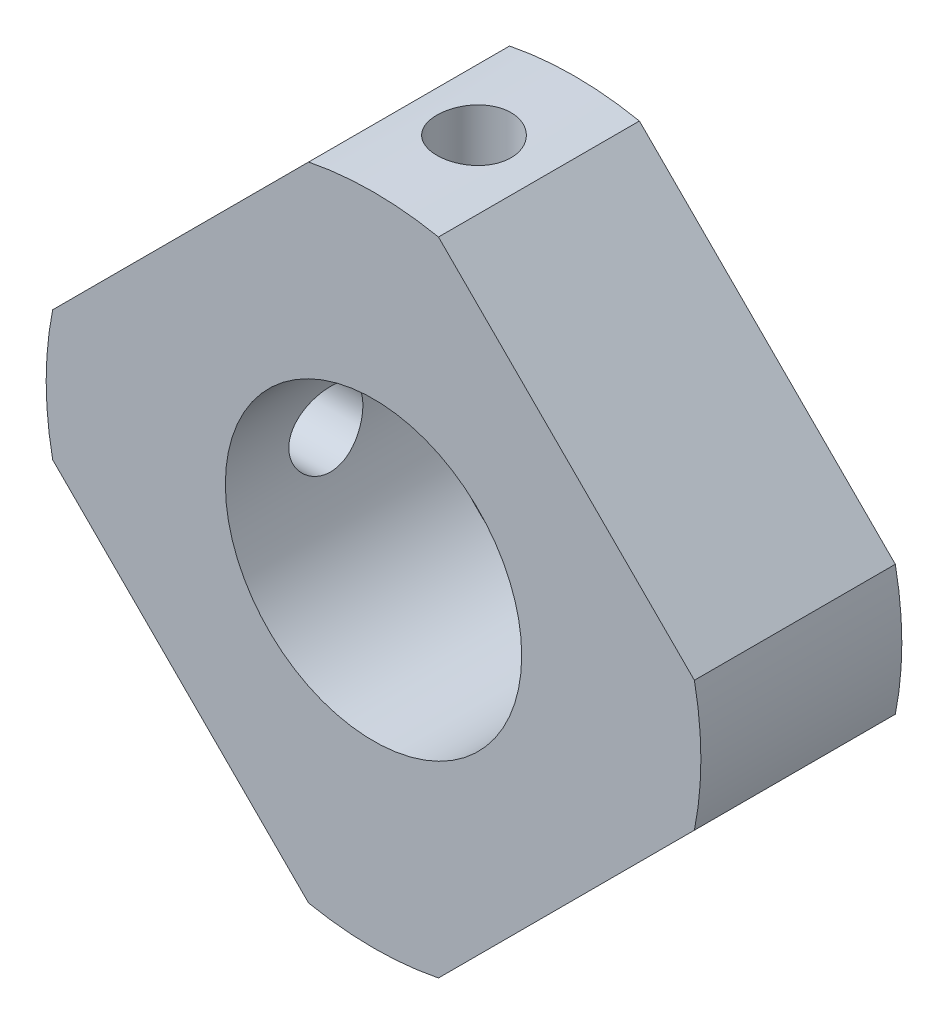
ISO-10303-21;
HEADER;
FILE_DESCRIPTION(('STEP AP214'),'2;1');
FILE_NAME('part.step','',(''),(''),'','','');
FILE_SCHEMA(('AUTOMOTIVE_DESIGN { 1 0 10303 214 1 1 1 1 }'));
ENDSEC;
DATA;
#1=APPLICATION_CONTEXT('core data for automotive mechanical design processes');
#2=APPLICATION_PROTOCOL_DEFINITION('international standard','automotive_design',2000,#1);
#3=PRODUCT_CONTEXT('',#1,'mechanical');
#4=PRODUCT('Part','Part','',(#3));
#5=PRODUCT_RELATED_PRODUCT_CATEGORY('part','',(#4));
#6=PRODUCT_DEFINITION_FORMATION('','',#4);
#7=PRODUCT_DEFINITION_CONTEXT('part definition',#1,'design');
#8=PRODUCT_DEFINITION('design','',#6,#7);
#9=PRODUCT_DEFINITION_SHAPE('','',#8);
#10=(LENGTH_UNIT() NAMED_UNIT(*) SI_UNIT(.MILLI.,.METRE.));
#11=(NAMED_UNIT(*) PLANE_ANGLE_UNIT() SI_UNIT($,.RADIAN.));
#12=(NAMED_UNIT(*) SI_UNIT($,.STERADIAN.) SOLID_ANGLE_UNIT());
#13=UNCERTAINTY_MEASURE_WITH_UNIT(LENGTH_MEASURE(1.E-05),#10,'distance_accuracy_value','');
#14=(GEOMETRIC_REPRESENTATION_CONTEXT(3) GLOBAL_UNCERTAINTY_ASSIGNED_CONTEXT((#13)) GLOBAL_UNIT_ASSIGNED_CONTEXT((#10,
#11,#12)) REPRESENTATION_CONTEXT('',''));
#15=CARTESIAN_POINT('',(0.,0.,0.));
#16=DIRECTION('',(0.,0.,1.));
#17=DIRECTION('',(1.,0.,0.));
#18=AXIS2_PLACEMENT_3D('',#15,#16,#17);
#19=CARTESIAN_POINT('',(0.,0.,-0.7775));
#20=DIRECTION('',(0.,0.,-1.));
#21=DIRECTION('',(-1.,0.,0.));
#22=AXIS2_PLACEMENT_3D('',#19,#20,#21);
#23=PLANE('',#22);
#24=CARTESIAN_POINT('',(0.,0.,-0.7775));
#25=DIRECTION('',(0.,0.,1.));
#26=DIRECTION('',(1.,0.,0.));
#27=AXIS2_PLACEMENT_3D('',#24,#25,#26);
#28=CIRCLE('',#27,7.2);
#29=CARTESIAN_POINT('',(7.2,0.,-0.7775));
#30=VERTEX_POINT('',#29);
#31=EDGE_CURVE('E20',#30,#30,#28,.T.);
#32=ORIENTED_EDGE('',*,*,#31,.F.);
#33=EDGE_LOOP('',(#32));
#34=FACE_BOUND('',#33,.T.);
#35=CARTESIAN_POINT('',(0.,0.,-0.777499999969677));
#36=DIRECTION('',(0.,0.,-1.));
#37=DIRECTION('',(0.,1.,0.));
#38=AXIS2_PLACEMENT_3D('',#35,#36,#37);
#39=CIRCLE('',#38,5.65999999997757);
#40=CARTESIAN_POINT('',(0.,5.65999999997757,-0.777499999969677));
#41=VERTEX_POINT('',#40);
#42=EDGE_CURVE('E277',#41,#41,#39,.F.);
#43=ORIENTED_EDGE('',*,*,#42,.T.);
#44=EDGE_LOOP('',(#43));
#45=FACE_BOUND('',#44,.T.);
#46=ADVANCED_FACE('F17',(#34,#45),#23,.T.);
#47=CARTESIAN_POINT('',(0.,0.,-0.7775));
#48=DIRECTION('',(0.,0.,1.));
#49=DIRECTION('',(1.,0.,0.));
#50=AXIS2_PLACEMENT_3D('',#47,#48,#49);
#51=CYLINDRICAL_SURFACE('',#50,7.2);
#52=ORIENTED_EDGE('',*,*,#31,.T.);
#53=EDGE_LOOP('',(#52));
#54=FACE_BOUND('',#53,.T.);
#55=CARTESIAN_POINT('',(0.,0.,0.));
#56=DIRECTION('',(0.,0.,1.));
#57=DIRECTION('',(1.,0.,0.));
#58=AXIS2_PLACEMENT_3D('',#55,#56,#57);
#59=CIRCLE('',#58,7.2);
#60=CARTESIAN_POINT('',(7.2,0.,0.));
#61=VERTEX_POINT('',#60);
#62=EDGE_CURVE('E200',#61,#61,#59,.F.);
#63=ORIENTED_EDGE('',*,*,#62,.T.);
#64=EDGE_LOOP('',(#63));
#65=FACE_BOUND('',#64,.T.);
#66=ADVANCED_FACE('F209',(#54,#65),#51,.T.);
#67=CARTESIAN_POINT('',(0.,0.,-0.777499999855991));
#68=DIRECTION('',(0.,0.,-1.));
#69=DIRECTION('',(0.,1.,0.));
#70=AXIS2_PLACEMENT_3D('',#67,#68,#69);
#71=CONICAL_SURFACE('',#70,5.65999999986389,0.785398163397448);
#72=ORIENTED_EDGE('',*,*,#42,.F.);
#73=EDGE_LOOP('',(#72));
#74=FACE_BOUND('',#73,.T.);
#75=CARTESIAN_POINT('',(0.,0.,-0.277499999999975));
#76=DIRECTION('',(0.,0.,1.));
#77=DIRECTION('',(1.,0.,0.));
#78=AXIS2_PLACEMENT_3D('',#75,#76,#77);
#79=CIRCLE('',#78,5.16);
#80=CARTESIAN_POINT('',(5.16,0.,-0.277499999999975));
#81=VERTEX_POINT('',#80);
#82=EDGE_CURVE('E90',#81,#81,#79,.T.);
#83=ORIENTED_EDGE('',*,*,#82,.T.);
#84=EDGE_LOOP('',(#83));
#85=FACE_BOUND('',#84,.T.);
#86=ADVANCED_FACE('F205',(#74,#85),#71,.F.);
#87=CARTESIAN_POINT('',(0.,11.401,3.49875));
#88=DIRECTION('',(0.,-1.,0.));
#89=DIRECTION('',(0.,0.,-1.));
#90=AXIS2_PLACEMENT_3D('',#87,#88,#89);
#91=CYLINDRICAL_SURFACE('',#90,1.29);
#92=CARTESIAN_POINT('',(0.,5.16,4.78875));
#93=CARTESIAN_POINT('',(-0.071190903754784,5.15999788647902,4.78874635904543));
#94=CARTESIAN_POINT('',(-0.142465526944808,5.15851032985863,4.78283070743921));
#95=CARTESIAN_POINT('',(-0.283035522912154,5.15271408475157,4.75933997997068));
#96=CARTESIAN_POINT('',(-0.352326912521383,5.14840008493651,4.74174295215403));
#97=CARTESIAN_POINT('',(-0.486785315274055,5.13742952101365,4.69548873234386));
#98=CARTESIAN_POINT('',(-0.551959176158829,5.13077697389399,4.66685049802864));
#99=CARTESIAN_POINT('',(-0.67655612083319,5.11583954874223,4.59938266477753));
#100=CARTESIAN_POINT('',(-0.735980685868809,5.1075550928333,4.56055570048286));
#101=CARTESIAN_POINT('',(-0.848647898938477,5.09005999564214,4.47295853273107));
#102=CARTESIAN_POINT('',(-0.901754923722288,5.08083498743362,4.42401673551234));
#103=CARTESIAN_POINT('',(-0.999101699239088,5.0625936293268,4.31794424120583));
#104=CARTESIAN_POINT('',(-1.04333996237656,5.05357731465753,4.26081217308046));
#105=CARTESIAN_POINT('',(-1.12232296929262,5.03663103715008,4.13893786380471));
#106=CARTESIAN_POINT('',(-1.15691717145442,5.02871917079593,4.07409531594256));
#107=CARTESIAN_POINT('',(-1.2146615250668,5.01508561085017,3.9392858222593));
#108=CARTESIAN_POINT('',(-1.23781359476811,5.00936355017834,3.86931973764865));
#109=CARTESIAN_POINT('',(-1.27155714852952,5.00090410235172,3.72773063446954));
#110=CARTESIAN_POINT('',(-1.28239093771019,4.99810922664553,3.6561688767461));
#111=CARTESIAN_POINT('',(-1.29194512797209,4.99564851748745,3.51219311870249));
#112=CARTESIAN_POINT('',(-1.29066748508311,4.99598217876809,3.43977925788601));
#113=CARTESIAN_POINT('',(-1.2762284359588,4.99968916119421,3.29801263617844));
#114=CARTESIAN_POINT('',(-1.26335586229603,5.00298859996107,3.22862822371923));
#115=CARTESIAN_POINT('',(-1.22655295427801,5.01213766451193,3.09303593429273));
#116=CARTESIAN_POINT('',(-1.20262175933407,5.01798748876647,3.02682830498736));
#117=CARTESIAN_POINT('',(-1.1441339833786,5.0316462099994,2.89869314841817));
#118=CARTESIAN_POINT('',(-1.10947227462679,5.03947434271427,2.83681574396513));
#119=CARTESIAN_POINT('',(-1.0305833560396,5.05619611053951,2.71965618622482));
#120=CARTESIAN_POINT('',(-0.986355112327044,5.06508986076723,2.66437474678121));
#121=CARTESIAN_POINT('',(-0.888100753494316,5.08325073614447,2.56032544028624));
#122=CARTESIAN_POINT('',(-0.833832461352556,5.09252129918065,2.51178660387163));
#123=CARTESIAN_POINT('',(-0.717789989904824,5.11016794257313,2.4244352081117));
#124=CARTESIAN_POINT('',(-0.656012598668595,5.11854363726126,2.38562683275027));
#125=CARTESIAN_POINT('',(-0.526361438583042,5.13349965673873,2.31875482119075));
#126=CARTESIAN_POINT('',(-0.458463211358607,5.14007231217693,2.29073688503316));
#127=CARTESIAN_POINT('',(-0.318802333196666,5.15061563257752,2.2466293096538));
#128=CARTESIAN_POINT('',(-0.247048068783434,5.15459171523917,2.23051482483153));
#129=CARTESIAN_POINT('',(-0.145585937262208,5.15802772236951,2.21665811202893));
#130=CARTESIAN_POINT('',(-0.11655707422069,5.15876550555189,2.21369543636887));
#131=CARTESIAN_POINT('',(-0.0583568311839987,5.1597520781768,2.20974063169468));
#132=CARTESIAN_POINT('',(-0.029185450851074,5.16000086645989,2.20874850735283));
#133=CARTESIAN_POINT('',(0.0711909037547823,5.15999788647902,2.20875364095455));
#134=CARTESIAN_POINT('',(0.142465526944806,5.15851032985863,2.21466929256079));
#135=CARTESIAN_POINT('',(0.283035522912152,5.15271408475156,2.23816002002932));
#136=CARTESIAN_POINT('',(0.352326912521382,5.14840008493651,2.25575704784598));
#137=CARTESIAN_POINT('',(0.486785315274055,5.13742952101365,2.30201126765614));
#138=CARTESIAN_POINT('',(0.551959176158829,5.13077697389399,2.33064950197136));
#139=CARTESIAN_POINT('',(0.676556120833191,5.11583954874223,2.39811733522248));
#140=CARTESIAN_POINT('',(0.735980685868809,5.1075550928333,2.43694429951714));
#141=CARTESIAN_POINT('',(0.848647898938477,5.09005999564214,2.52454146726893));
#142=CARTESIAN_POINT('',(0.901754923722288,5.08083498743362,2.57348326448766));
#143=CARTESIAN_POINT('',(0.999101699239088,5.0625936293268,2.67955575879417));
#144=CARTESIAN_POINT('',(1.04333996237656,5.05357731465753,2.73668782691954));
#145=CARTESIAN_POINT('',(1.12232296929262,5.03663103715008,2.85856213619529));
#146=CARTESIAN_POINT('',(1.15691717145442,5.02871917079593,2.92340468405744));
#147=CARTESIAN_POINT('',(1.21466152506681,5.01508561085017,3.0582141777407));
#148=CARTESIAN_POINT('',(1.23781359476811,5.00936355017834,3.12818026235135));
#149=CARTESIAN_POINT('',(1.27155714852952,5.00090410235172,3.26976936553046));
#150=CARTESIAN_POINT('',(1.28239093771019,4.99810922664553,3.3413311232539));
#151=CARTESIAN_POINT('',(1.29194512797209,4.99564851748745,3.48530688129751));
#152=CARTESIAN_POINT('',(1.29066748508311,4.99598217876809,3.55772074211399));
#153=CARTESIAN_POINT('',(1.2762284359588,4.99968916119421,3.69948736382156));
#154=CARTESIAN_POINT('',(1.26335586229603,5.00298859996107,3.76887177628077));
#155=CARTESIAN_POINT('',(1.22655295427801,5.01213766451193,3.90446406570727));
#156=CARTESIAN_POINT('',(1.20262175933407,5.01798748876647,3.97067169501264));
#157=CARTESIAN_POINT('',(1.1441339833786,5.0316462099994,4.09880685158183));
#158=CARTESIAN_POINT('',(1.10947227462679,5.03947434271427,4.16068425603487));
#159=CARTESIAN_POINT('',(1.0305833560396,5.05619611053951,4.27784381377518));
#160=CARTESIAN_POINT('',(0.986355112327043,5.06508986076723,4.33312525321879));
#161=CARTESIAN_POINT('',(0.888100753494315,5.08325073614447,4.43717455971376));
#162=CARTESIAN_POINT('',(0.833832461352556,5.09252129918065,4.48571339612837));
#163=CARTESIAN_POINT('',(0.717789989904825,5.11016794257313,4.5730647918883));
#164=CARTESIAN_POINT('',(0.656012598668595,5.11854363726126,4.61187316724973));
#165=CARTESIAN_POINT('',(0.526361438583041,5.13349965673873,4.67874517880925));
#166=CARTESIAN_POINT('',(0.458463211358606,5.14007231217693,4.70676311496684));
#167=CARTESIAN_POINT('',(0.318802333196666,5.15061563257752,4.7508706903462));
#168=CARTESIAN_POINT('',(0.247048068783434,5.15459171523917,4.76698517516847));
#169=CARTESIAN_POINT('',(0.145585937262208,5.15802772236952,4.78084188797107));
#170=CARTESIAN_POINT('',(0.11655707422069,5.15876550555189,4.78380456363113));
#171=CARTESIAN_POINT('',(0.058356831183998,5.1597520781768,4.78775936830532));
#172=CARTESIAN_POINT('',(0.029185450851073,5.16000086645989,4.78875149264717));
#173=CARTESIAN_POINT('',(0.,5.16,4.78875));
#174=B_SPLINE_CURVE_WITH_KNOTS('',3,(#92,#93,#94,#95,#96,#97,#98,#99,#100,#101,#102,#103,#104,
#105,#106,#107,#108,#109,#110,#111,#112,#113,#114,#115,#116,#117,#118,#119,#120,#121,#122,#123,
#124,#125,#126,#127,#128,#129,#130,#131,#132,#133,#134,#135,#136,#137,#138,#139,#140,#141,#142,
#143,#144,#145,#146,#147,#148,#149,#150,#151,#152,#153,#154,#155,#156,#157,#158,#159,#160,#161,
#162,#163,#164,#165,#166,#167,#168,#169,#170,#171,#172,#173),.UNSPECIFIED.,.T.,.F.,(4,2,2,2,2,2,
2,2,2,2,2,2,2,2,2,2,2,2,2,2,2,2,2,2,2,2,2,2,2,2,2,2,2,2,2,2,2,2,2,2,4),(0.,0.21346080406431,
0.427323889281876,0.640821396666923,0.85426375134839,1.07167819553489,1.28912907712496,
1.50980522723227,1.73044436886207,1.94666400945396,2.16284873057074,2.37379278233263,
2.58475325265536,2.79784967751461,3.01096914370602,3.23012921964416,3.44938337085077,
3.66955616248188,3.88926808750161,3.97677835504439,4.06428883007795,4.27774963414226,
4.49161271935983,4.70511022674487,4.91855258142634,5.13596702561284,5.35341790720291,
5.57409405731022,5.79473319894002,6.01095283953192,6.22713756064869,6.43808161241058,
6.64904208273331,6.86213850759257,7.07525797378397,7.29441804972211,7.51367220092872,
7.73384499255983,7.95355691757956,8.04106718512234,8.1285776601559),.UNSPECIFIED.);
#175=CARTESIAN_POINT('',(0.,5.16,4.78875));
#176=VERTEX_POINT('',#175);
#177=EDGE_CURVE('E194',#176,#176,#174,.T.);
#178=ORIENTED_EDGE('',*,*,#177,.T.);
#179=EDGE_LOOP('',(#178));
#180=FACE_BOUND('',#179,.T.);
#181=CARTESIAN_POINT('',(0.,11.4,4.78875));
#182=CARTESIAN_POINT('',(-0.0721472439682258,11.3999990905321,4.78874685665249));
#183=CARTESIAN_POINT('',(-0.144389555793133,11.399307323242,4.7826723158255));
#184=CARTESIAN_POINT('',(-0.286917089918186,11.396612808655,4.75852079382584));
#185=CARTESIAN_POINT('',(-0.357197900768133,11.3946073212056,4.74041872455081));
#186=CARTESIAN_POINT('',(-0.493644715145373,11.3895114207856,4.69274686330453));
#187=CARTESIAN_POINT('',(-0.559814864854268,11.3864221226132,4.66318885155587));
#188=CARTESIAN_POINT('',(-0.686223758085334,11.3795039017083,4.59346757277317));
#189=CARTESIAN_POINT('',(-0.74646501376437,11.3756752942861,4.55330882421236));
#190=CARTESIAN_POINT('',(-0.859620068045193,11.3676861724965,4.46332237388044));
#191=CARTESIAN_POINT('',(-0.912502399510318,11.3635243458604,4.41345521291808));
#192=CARTESIAN_POINT('',(-1.00916886522236,11.3553484157494,4.30554981187714));
#193=CARTESIAN_POINT('',(-1.05295210922367,11.3513343267607,4.24751077320123));
#194=CARTESIAN_POINT('',(-1.13028553883941,11.3438958640581,4.12471589378081));
#195=CARTESIAN_POINT('',(-1.16380758365309,11.3404731230722,4.05994222314994));
#196=CARTESIAN_POINT('',(-1.21948692851982,11.3346213039399,3.92564039904343));
#197=CARTESIAN_POINT('',(-1.24164468299635,11.3321921860624,3.85611243580354));
#198=CARTESIAN_POINT('',(-1.27387459715334,11.3286145677216,3.71459158443755));
#199=CARTESIAN_POINT('',(-1.28399822536437,11.3274606150312,3.64261055793433));
#200=CARTESIAN_POINT('',(-1.29203168679511,11.3265471960216,3.49796247124944));
#201=CARTESIAN_POINT('',(-1.28994190426707,11.3267876858311,3.42529543272256));
#202=CARTESIAN_POINT('',(-1.27365023457254,11.3286309897235,3.28169560578948));
#203=CARTESIAN_POINT('',(-1.25950490137394,11.3302274427091,3.21075630802219));
#204=CARTESIAN_POINT('',(-1.21959156135715,11.3345928904584,3.07226435113717));
#205=CARTESIAN_POINT('',(-1.19382325408011,11.3373619155336,3.00471177961791));
#206=CARTESIAN_POINT('',(-1.13133281662771,11.3437678894243,2.87473219515155));
#207=CARTESIAN_POINT('',(-1.09458548324298,11.3474068313183,2.81231740147325));
#208=CARTESIAN_POINT('',(-1.01120140945711,11.3551406374385,2.69452450140009));
#209=CARTESIAN_POINT('',(-0.964565106777244,11.3592354814811,2.63914608372341));
#210=CARTESIAN_POINT('',(-0.862421679642211,11.3674474990631,2.53667352705406));
#211=CARTESIAN_POINT('',(-0.806867459971433,11.3715646723115,2.48962632518416));
#212=CARTESIAN_POINT('',(-0.688594828944132,11.3793384424265,2.40549584432344));
#213=CARTESIAN_POINT('',(-0.625873136971337,11.3829948267628,2.36841715425137));
#214=CARTESIAN_POINT('',(-0.494995402905408,11.3894370530434,2.30528127718616));
#215=CARTESIAN_POINT('',(-0.426833636106462,11.3922219623435,2.27923588745453));
#216=CARTESIAN_POINT('',(-0.287158350661807,11.3965958116726,2.2390272330522));
#217=CARTESIAN_POINT('',(-0.215652276574025,11.3981872852079,2.22483879027908));
#218=CARTESIAN_POINT('',(-0.119719008003191,11.399396565858,2.21409240172387));
#219=CARTESIAN_POINT('',(-0.0958225061600318,11.3996223998837,2.21209049421805));
#220=CARTESIAN_POINT('',(-0.0479541710739476,11.3999242681335,2.20941877072804));
#221=CARTESIAN_POINT('',(-0.0239823378094466,11.4000003023146,2.20874895512541));
#222=CARTESIAN_POINT('',(0.072147243968225,11.3999990905321,2.20875314334751));
#223=CARTESIAN_POINT('',(0.144389555793132,11.399307323242,2.2148276841745));
#224=CARTESIAN_POINT('',(0.286917089918185,11.396612808655,2.23897920617416));
#225=CARTESIAN_POINT('',(0.357197900768132,11.3946073212056,2.25708127544919));
#226=CARTESIAN_POINT('',(0.493644715145373,11.3895114207856,2.30475313669547));
#227=CARTESIAN_POINT('',(0.559814864854268,11.3864221226132,2.33431114844413));
#228=CARTESIAN_POINT('',(0.686223758085334,11.3795039017083,2.40403242722683));
#229=CARTESIAN_POINT('',(0.746465013764369,11.3756752942861,2.44419117578764));
#230=CARTESIAN_POINT('',(0.859620068045192,11.3676861724965,2.53417762611956));
#231=CARTESIAN_POINT('',(0.912502399510317,11.3635243458604,2.58404478708192));
#232=CARTESIAN_POINT('',(1.00916886522236,11.3553484157494,2.69195018812286));
#233=CARTESIAN_POINT('',(1.05295210922367,11.3513343267607,2.74998922679877));
#234=CARTESIAN_POINT('',(1.13028553883941,11.3438958640581,2.87278410621919));
#235=CARTESIAN_POINT('',(1.16380758365309,11.3404731230722,2.93755777685006));
#236=CARTESIAN_POINT('',(1.21948692851982,11.3346213039399,3.07185960095658));
#237=CARTESIAN_POINT('',(1.24164468299635,11.3321921860624,3.14138756419646));
#238=CARTESIAN_POINT('',(1.27387459715334,11.3286145677216,3.28290841556245));
#239=CARTESIAN_POINT('',(1.28399822536437,11.3274606150312,3.35488944206567));
#240=CARTESIAN_POINT('',(1.29203168679511,11.3265471960216,3.49953752875056));
#241=CARTESIAN_POINT('',(1.28994190426707,11.3267876858311,3.57220456727744));
#242=CARTESIAN_POINT('',(1.27365023457254,11.3286309897235,3.71580439421052));
#243=CARTESIAN_POINT('',(1.25950490137394,11.3302274427091,3.78674369197781));
#244=CARTESIAN_POINT('',(1.21959156135715,11.3345928904584,3.92523564886283));
#245=CARTESIAN_POINT('',(1.19382325408011,11.3373619155336,3.99278822038209));
#246=CARTESIAN_POINT('',(1.13133281662771,11.3437678894243,4.12276780484845));
#247=CARTESIAN_POINT('',(1.09458548324298,11.3474068313183,4.18518259852675));
#248=CARTESIAN_POINT('',(1.01120140945711,11.3551406374385,4.30297549859991));
#249=CARTESIAN_POINT('',(0.964565106777245,11.3592354814811,4.35835391627659));
#250=CARTESIAN_POINT('',(0.862421679642212,11.3674474990631,4.46082647294594));
#251=CARTESIAN_POINT('',(0.806867459971434,11.3715646723115,4.50787367481584));
#252=CARTESIAN_POINT('',(0.688594828944132,11.3793384424265,4.59200415567656));
#253=CARTESIAN_POINT('',(0.625873136971338,11.3829948267628,4.62908284574863));
#254=CARTESIAN_POINT('',(0.494995402905409,11.3894370530434,4.69221872281384));
#255=CARTESIAN_POINT('',(0.426833636106463,11.3922219623435,4.71826411254547));
#256=CARTESIAN_POINT('',(0.287158350661808,11.3965958116726,4.7584727669478));
#257=CARTESIAN_POINT('',(0.215652276574025,11.3981872852079,4.77266120972092));
#258=CARTESIAN_POINT('',(0.11971900800319,11.399396565858,4.78340759827613));
#259=CARTESIAN_POINT('',(0.0958225061600311,11.3996223998837,4.78540950578195));
#260=CARTESIAN_POINT('',(0.0479541710739465,11.3999242681335,4.78808122927196));
#261=CARTESIAN_POINT('',(0.0239823378094457,11.4000003023146,4.78875104487459));
#262=CARTESIAN_POINT('',(0.,11.4,4.78875));
#263=B_SPLINE_CURVE_WITH_KNOTS('',3,(#181,#182,#183,#184,#185,#186,#187,#188,#189,#190,#191,
#192,#193,#194,#195,#196,#197,#198,#199,#200,#201,#202,#203,#204,#205,#206,#207,#208,#209,#210,
#211,#212,#213,#214,#215,#216,#217,#218,#219,#220,#221,#222,#223,#224,#225,#226,#227,#228,#229,
#230,#231,#232,#233,#234,#235,#236,#237,#238,#239,#240,#241,#242,#243,#244,#245,#246,#247,#248,
#249,#250,#251,#252,#253,#254,#255,#256,#257,#258,#259,#260,#261,#262),.UNSPECIFIED.,.T.,.F.,(4,
2,2,2,2,2,2,2,2,2,2,2,2,2,2,2,2,2,2,2,2,2,2,2,2,2,2,2,2,2,2,2,2,2,2,2,2,2,2,2,4),(0.,
0.21635036937941,0.433153444566424,0.64973416867851,0.866222725761203,1.08361028243464,
1.30101909808646,1.51901891183842,1.73701000775955,1.95406538819262,2.17111393977412,
2.38714986107761,2.60319136732208,2.81973267481046,3.03626439940306,3.25397970359516,
3.47179506021021,3.68984272974286,3.90742619222602,3.97934281539932,4.05125945917217,
4.26760982855158,4.48441290373859,4.70099362785068,4.91748218493337,5.13486974160681,
5.35227855725863,5.57027837101059,5.78826946693171,6.00532484736478,6.22237339894628,
6.43840932024978,6.65445082649424,6.87099213398263,7.08752385857522,7.30523916276733,
7.52305451938237,7.74110218891503,7.95868565139818,8.03060227457149,8.10251891834433),.UNSPECIFIED.);
#264=CARTESIAN_POINT('',(0.,11.4,4.78875));
#265=VERTEX_POINT('',#264);
#266=EDGE_CURVE('E145',#265,#265,#263,.T.);
#267=ORIENTED_EDGE('',*,*,#266,.F.);
#268=EDGE_LOOP('',(#267));
#269=FACE_BOUND('',#268,.T.);
#270=ADVANCED_FACE('F201',(#180,#269),#91,.F.);
#271=CARTESIAN_POINT('',(-11.401,0.,3.49875));
#272=DIRECTION('',(1.,0.,0.));
#273=DIRECTION('',(0.,0.,-1.));
#274=AXIS2_PLACEMENT_3D('',#271,#272,#273);
#275=CYLINDRICAL_SURFACE('',#274,1.29);
#276=CARTESIAN_POINT('',(-5.16,0.,4.78875));
#277=CARTESIAN_POINT('',(-5.15999788647902,-0.0711909037547834,4.78874635904543));
#278=CARTESIAN_POINT('',(-5.15851032985863,-0.142465526944807,4.78283070743921));
#279=CARTESIAN_POINT('',(-5.15271408475157,-0.283035522912153,4.75933997997068));
#280=CARTESIAN_POINT('',(-5.14840008493651,-0.352326912521382,4.74174295215403));
#281=CARTESIAN_POINT('',(-5.13742952101365,-0.486785315274054,4.69548873234386));
#282=CARTESIAN_POINT('',(-5.13077697389399,-0.551959176158827,4.66685049802864));
#283=CARTESIAN_POINT('',(-5.11583954874223,-0.676556120833189,4.59938266477753));
#284=CARTESIAN_POINT('',(-5.1075550928333,-0.735980685868807,4.56055570048287));
#285=CARTESIAN_POINT('',(-5.09005999564214,-0.848647898938476,4.47295853273107));
#286=CARTESIAN_POINT('',(-5.08083498743362,-0.901754923722287,4.42401673551234));
#287=CARTESIAN_POINT('',(-5.0625936293268,-0.999101699239087,4.31794424120584));
#288=CARTESIAN_POINT('',(-5.05357731465753,-1.04333996237656,4.26081217308047));
#289=CARTESIAN_POINT('',(-5.03663103715008,-1.12232296929262,4.13893786380471));
#290=CARTESIAN_POINT('',(-5.02871917079593,-1.15691717145442,4.07409531594256));
#291=CARTESIAN_POINT('',(-5.01508561085018,-1.2146615250668,3.9392858222593));
#292=CARTESIAN_POINT('',(-5.00936355017834,-1.23781359476811,3.86931973764865));
#293=CARTESIAN_POINT('',(-5.00090410235172,-1.27155714852952,3.72773063446954));
#294=CARTESIAN_POINT('',(-4.99810922664553,-1.28239093771019,3.6561688767461));
#295=CARTESIAN_POINT('',(-4.99564851748745,-1.29194512797209,3.51219311870249));
#296=CARTESIAN_POINT('',(-4.99598217876809,-1.29066748508311,3.43977925788601));
#297=CARTESIAN_POINT('',(-4.99968916119421,-1.2762284359588,3.29801263617844));
#298=CARTESIAN_POINT('',(-5.00298859996107,-1.26335586229603,3.22862822371923));
#299=CARTESIAN_POINT('',(-5.01213766451193,-1.22655295427801,3.09303593429274));
#300=CARTESIAN_POINT('',(-5.01798748876647,-1.20262175933407,3.02682830498736));
#301=CARTESIAN_POINT('',(-5.0316462099994,-1.1441339833786,2.89869314841817));
#302=CARTESIAN_POINT('',(-5.03947434271427,-1.10947227462679,2.83681574396513));
#303=CARTESIAN_POINT('',(-5.05619611053951,-1.03058335603961,2.71965618622482));
#304=CARTESIAN_POINT('',(-5.06508986076723,-0.986355112327045,2.66437474678121));
#305=CARTESIAN_POINT('',(-5.08325073614447,-0.888100753494317,2.56032544028624));
#306=CARTESIAN_POINT('',(-5.09252129918065,-0.833832461352557,2.51178660387163));
#307=CARTESIAN_POINT('',(-5.11016794257313,-0.717789989904826,2.4244352081117));
#308=CARTESIAN_POINT('',(-5.11854363726126,-0.656012598668596,2.38562683275027));
#309=CARTESIAN_POINT('',(-5.13349965673873,-0.526361438583043,2.31875482119075));
#310=CARTESIAN_POINT('',(-5.14007231217693,-0.458463211358608,2.29073688503316));
#311=CARTESIAN_POINT('',(-5.15061563257752,-0.318802333196668,2.2466293096538));
#312=CARTESIAN_POINT('',(-5.15459171523917,-0.247048068783436,2.23051482483153));
#313=CARTESIAN_POINT('',(-5.15802772236951,-0.14558593726221,2.21665811202893));
#314=CARTESIAN_POINT('',(-5.15876550555189,-0.116557074220692,2.21369543636887));
#315=CARTESIAN_POINT('',(-5.1597520781768,-0.0583568311839995,2.20974063169468));
#316=CARTESIAN_POINT('',(-5.16000086645989,-0.0291854508510744,2.20874850735283));
#317=CARTESIAN_POINT('',(-5.15999788647902,0.0711909037547825,2.20875364095455));
#318=CARTESIAN_POINT('',(-5.15851032985863,0.142465526944806,2.21466929256079));
#319=CARTESIAN_POINT('',(-5.15271408475156,0.283035522912153,2.23816002002932));
#320=CARTESIAN_POINT('',(-5.14840008493651,0.352326912521382,2.25575704784598));
#321=CARTESIAN_POINT('',(-5.13742952101365,0.486785315274055,2.30201126765614));
#322=CARTESIAN_POINT('',(-5.13077697389399,0.551959176158829,2.33064950197136));
#323=CARTESIAN_POINT('',(-5.11583954874223,0.67655612083319,2.39811733522248));
#324=CARTESIAN_POINT('',(-5.1075550928333,0.735980685868808,2.43694429951714));
#325=CARTESIAN_POINT('',(-5.09005999564214,0.848647898938476,2.52454146726893));
#326=CARTESIAN_POINT('',(-5.08083498743362,0.901754923722287,2.57348326448766));
#327=CARTESIAN_POINT('',(-5.0625936293268,0.999101699239087,2.67955575879417));
#328=CARTESIAN_POINT('',(-5.05357731465753,1.04333996237656,2.73668782691954));
#329=CARTESIAN_POINT('',(-5.03663103715008,1.12232296929262,2.85856213619529));
#330=CARTESIAN_POINT('',(-5.02871917079593,1.15691717145442,2.92340468405744));
#331=CARTESIAN_POINT('',(-5.01508561085018,1.2146615250668,3.05821417774071));
#332=CARTESIAN_POINT('',(-5.00936355017834,1.23781359476811,3.12818026235135));
#333=CARTESIAN_POINT('',(-5.00090410235172,1.27155714852952,3.26976936553046));
#334=CARTESIAN_POINT('',(-4.99810922664553,1.28239093771019,3.3413311232539));
#335=CARTESIAN_POINT('',(-4.99564851748745,1.29194512797209,3.48530688129751));
#336=CARTESIAN_POINT('',(-4.99598217876809,1.29066748508311,3.55772074211399));
#337=CARTESIAN_POINT('',(-4.99968916119421,1.2762284359588,3.69948736382156));
#338=CARTESIAN_POINT('',(-5.00298859996107,1.26335586229603,3.76887177628077));
#339=CARTESIAN_POINT('',(-5.01213766451193,1.22655295427801,3.90446406570727));
#340=CARTESIAN_POINT('',(-5.01798748876647,1.20262175933406,3.97067169501264));
#341=CARTESIAN_POINT('',(-5.0316462099994,1.1441339833786,4.09880685158183));
#342=CARTESIAN_POINT('',(-5.03947434271427,1.10947227462679,4.16068425603487));
#343=CARTESIAN_POINT('',(-5.05619611053951,1.0305833560396,4.27784381377518));
#344=CARTESIAN_POINT('',(-5.06508986076723,0.986355112327042,4.33312525321879));
#345=CARTESIAN_POINT('',(-5.08325073614447,0.888100753494315,4.43717455971376));
#346=CARTESIAN_POINT('',(-5.09252129918065,0.833832461352555,4.48571339612837));
#347=CARTESIAN_POINT('',(-5.11016794257313,0.717789989904824,4.5730647918883));
#348=CARTESIAN_POINT('',(-5.11854363726126,0.656012598668594,4.61187316724973));
#349=CARTESIAN_POINT('',(-5.13349965673873,0.52636143858304,4.67874517880925));
#350=CARTESIAN_POINT('',(-5.14007231217693,0.458463211358605,4.70676311496684));
#351=CARTESIAN_POINT('',(-5.15061563257752,0.318802333196664,4.7508706903462));
#352=CARTESIAN_POINT('',(-5.15459171523917,0.247048068783432,4.76698517516847));
#353=CARTESIAN_POINT('',(-5.15802772236952,0.145585937262207,4.78084188797107));
#354=CARTESIAN_POINT('',(-5.15876550555189,0.116557074220689,4.78380456363113));
#355=CARTESIAN_POINT('',(-5.1597520781768,0.0583568311839978,4.78775936830532));
#356=CARTESIAN_POINT('',(-5.16000086645989,0.0291854508510732,4.78875149264717));
#357=CARTESIAN_POINT('',(-5.16,0.,4.78875));
#358=B_SPLINE_CURVE_WITH_KNOTS('',3,(#276,#277,#278,#279,#280,#281,#282,#283,#284,#285,#286,
#287,#288,#289,#290,#291,#292,#293,#294,#295,#296,#297,#298,#299,#300,#301,#302,#303,#304,#305,
#306,#307,#308,#309,#310,#311,#312,#313,#314,#315,#316,#317,#318,#319,#320,#321,#322,#323,#324,
#325,#326,#327,#328,#329,#330,#331,#332,#333,#334,#335,#336,#337,#338,#339,#340,#341,#342,#343,
#344,#345,#346,#347,#348,#349,#350,#351,#352,#353,#354,#355,#356,#357),.UNSPECIFIED.,.T.,.F.,(4,
2,2,2,2,2,2,2,2,2,2,2,2,2,2,2,2,2,2,2,2,2,2,2,2,2,2,2,2,2,2,2,2,2,2,2,2,2,2,2,4),(0.,
0.21346080406431,0.427323889281876,0.640821396666922,0.85426375134839,1.07167819553489,
1.28912907712496,1.50980522723227,1.73044436886207,1.94666400945397,2.16284873057074,
2.37379278233263,2.58475325265536,2.79784967751462,3.01096914370602,3.23012921964416,
3.44938337085077,3.66955616248188,3.88926808750161,3.97677835504439,4.06428883007795,
4.27774963414226,4.49161271935983,4.70511022674488,4.91855258142634,5.13596702561285,
5.35341790720291,5.57409405731022,5.79473319894002,6.01095283953192,6.22713756064869,
6.43808161241058,6.64904208273331,6.86213850759257,7.07525797378397,7.29441804972212,
7.51367220092872,7.73384499255983,7.95355691757956,8.04106718512235,8.1285776601559),.UNSPECIFIED.);
#359=CARTESIAN_POINT('',(-5.16,0.,4.78875));
#360=VERTEX_POINT('',#359);
#361=EDGE_CURVE('E123',#360,#360,#358,.T.);
#362=ORIENTED_EDGE('',*,*,#361,.T.);
#363=EDGE_LOOP('',(#362));
#364=FACE_BOUND('',#363,.T.);
#365=CARTESIAN_POINT('',(-11.4,0.,4.78875));
#366=CARTESIAN_POINT('',(-11.3999990905321,-0.0721472439682268,4.78874685665249));
#367=CARTESIAN_POINT('',(-11.399307323242,-0.144389555793134,4.7826723158255));
#368=CARTESIAN_POINT('',(-11.396612808655,-0.286917089918187,4.75852079382584));
#369=CARTESIAN_POINT('',(-11.3946073212056,-0.357197900768134,4.74041872455081));
#370=CARTESIAN_POINT('',(-11.3895114207856,-0.493644715145374,4.69274686330453));
#371=CARTESIAN_POINT('',(-11.3864221226132,-0.559814864854269,4.66318885155587));
#372=CARTESIAN_POINT('',(-11.3795039017083,-0.686223758085335,4.59346757277317));
#373=CARTESIAN_POINT('',(-11.3756752942861,-0.74646501376437,4.55330882421236));
#374=CARTESIAN_POINT('',(-11.3676861724965,-0.859620068045193,4.46332237388044));
#375=CARTESIAN_POINT('',(-11.3635243458604,-0.912502399510319,4.41345521291808));
#376=CARTESIAN_POINT('',(-11.3553484157494,-1.00916886522237,4.30554981187714));
#377=CARTESIAN_POINT('',(-11.3513343267607,-1.05295210922367,4.24751077320123));
#378=CARTESIAN_POINT('',(-11.3438958640581,-1.13028553883941,4.12471589378081));
#379=CARTESIAN_POINT('',(-11.3404731230722,-1.16380758365309,4.05994222314994));
#380=CARTESIAN_POINT('',(-11.3346213039399,-1.21948692851982,3.92564039904343));
#381=CARTESIAN_POINT('',(-11.3321921860624,-1.24164468299635,3.85611243580354));
#382=CARTESIAN_POINT('',(-11.3286145677216,-1.27387459715334,3.71459158443755));
#383=CARTESIAN_POINT('',(-11.3274606150312,-1.28399822536437,3.64261055793433));
#384=CARTESIAN_POINT('',(-11.3265471960216,-1.29203168679511,3.49796247124944));
#385=CARTESIAN_POINT('',(-11.3267876858311,-1.28994190426707,3.42529543272256));
#386=CARTESIAN_POINT('',(-11.3286309897235,-1.27365023457254,3.28169560578948));
#387=CARTESIAN_POINT('',(-11.3302274427091,-1.25950490137394,3.21075630802219));
#388=CARTESIAN_POINT('',(-11.3345928904584,-1.21959156135715,3.07226435113717));
#389=CARTESIAN_POINT('',(-11.3373619155336,-1.19382325408011,3.00471177961791));
#390=CARTESIAN_POINT('',(-11.3437678894243,-1.13133281662771,2.87473219515155));
#391=CARTESIAN_POINT('',(-11.3474068313183,-1.09458548324298,2.81231740147325));
#392=CARTESIAN_POINT('',(-11.3551406374385,-1.01120140945711,2.69452450140009));
#393=CARTESIAN_POINT('',(-11.3592354814811,-0.964565106777244,2.63914608372341));
#394=CARTESIAN_POINT('',(-11.3674474990631,-0.862421679642212,2.53667352705406));
#395=CARTESIAN_POINT('',(-11.3715646723115,-0.806867459971434,2.48962632518416));
#396=CARTESIAN_POINT('',(-11.3793384424265,-0.688594828944133,2.40549584432344));
#397=CARTESIAN_POINT('',(-11.3829948267628,-0.625873136971338,2.36841715425137));
#398=CARTESIAN_POINT('',(-11.3894370530434,-0.494995402905409,2.30528127718616));
#399=CARTESIAN_POINT('',(-11.3922219623435,-0.426833636106462,2.27923588745453));
#400=CARTESIAN_POINT('',(-11.3965958116726,-0.287158350661807,2.2390272330522));
#401=CARTESIAN_POINT('',(-11.3981872852079,-0.215652276574025,2.22483879027908));
#402=CARTESIAN_POINT('',(-11.399396565858,-0.119719008003191,2.21409240172387));
#403=CARTESIAN_POINT('',(-11.3996223998837,-0.0958225061600324,2.21209049421805));
#404=CARTESIAN_POINT('',(-11.3999242681335,-0.0479541710739484,2.20941877072804));
#405=CARTESIAN_POINT('',(-11.4000003023146,-0.0239823378094473,2.20874895512541));
#406=CARTESIAN_POINT('',(-11.3999990905321,0.0721472439682244,2.20875314334751));
#407=CARTESIAN_POINT('',(-11.399307323242,0.144389555793132,2.2148276841745));
#408=CARTESIAN_POINT('',(-11.396612808655,0.286917089918185,2.23897920617416));
#409=CARTESIAN_POINT('',(-11.3946073212056,0.357197900768132,2.25708127544919));
#410=CARTESIAN_POINT('',(-11.3895114207856,0.493644715145372,2.30475313669547));
#411=CARTESIAN_POINT('',(-11.3864221226132,0.559814864854267,2.33431114844413));
#412=CARTESIAN_POINT('',(-11.3795039017083,0.686223758085333,2.40403242722683));
#413=CARTESIAN_POINT('',(-11.3756752942861,0.746465013764368,2.44419117578764));
#414=CARTESIAN_POINT('',(-11.3676861724965,0.859620068045191,2.53417762611956));
#415=CARTESIAN_POINT('',(-11.3635243458604,0.912502399510316,2.58404478708192));
#416=CARTESIAN_POINT('',(-11.3553484157494,1.00916886522236,2.69195018812286));
#417=CARTESIAN_POINT('',(-11.3513343267607,1.05295210922367,2.74998922679877));
#418=CARTESIAN_POINT('',(-11.3438958640581,1.13028553883941,2.87278410621919));
#419=CARTESIAN_POINT('',(-11.3404731230722,1.16380758365309,2.93755777685006));
#420=CARTESIAN_POINT('',(-11.3346213039399,1.21948692851982,3.07185960095657));
#421=CARTESIAN_POINT('',(-11.3321921860624,1.24164468299635,3.14138756419646));
#422=CARTESIAN_POINT('',(-11.3286145677216,1.27387459715334,3.28290841556245));
#423=CARTESIAN_POINT('',(-11.3274606150312,1.28399822536437,3.35488944206567));
#424=CARTESIAN_POINT('',(-11.3265471960216,1.29203168679511,3.49953752875056));
#425=CARTESIAN_POINT('',(-11.3267876858311,1.28994190426707,3.57220456727744));
#426=CARTESIAN_POINT('',(-11.3286309897235,1.27365023457254,3.71580439421052));
#427=CARTESIAN_POINT('',(-11.3302274427091,1.25950490137394,3.78674369197781));
#428=CARTESIAN_POINT('',(-11.3345928904584,1.21959156135715,3.92523564886283));
#429=CARTESIAN_POINT('',(-11.3373619155336,1.19382325408011,3.99278822038209));
#430=CARTESIAN_POINT('',(-11.3437678894243,1.13133281662771,4.12276780484845));
#431=CARTESIAN_POINT('',(-11.3474068313183,1.09458548324298,4.18518259852675));
#432=CARTESIAN_POINT('',(-11.3551406374385,1.01120140945711,4.30297549859991));
#433=CARTESIAN_POINT('',(-11.3592354814811,0.964565106777245,4.35835391627659));
#434=CARTESIAN_POINT('',(-11.3674474990631,0.862421679642212,4.46082647294594));
#435=CARTESIAN_POINT('',(-11.3715646723115,0.806867459971434,4.50787367481584));
#436=CARTESIAN_POINT('',(-11.3793384424265,0.688594828944132,4.59200415567656));
#437=CARTESIAN_POINT('',(-11.3829948267628,0.625873136971337,4.62908284574863));
#438=CARTESIAN_POINT('',(-11.3894370530434,0.494995402905408,4.69221872281384));
#439=CARTESIAN_POINT('',(-11.3922219623435,0.426833636106462,4.71826411254547));
#440=CARTESIAN_POINT('',(-11.3965958116726,0.287158350661807,4.7584727669478));
#441=CARTESIAN_POINT('',(-11.3981872852079,0.215652276574025,4.77266120972092));
#442=CARTESIAN_POINT('',(-11.399396565858,0.11971900800319,4.78340759827613));
#443=CARTESIAN_POINT('',(-11.3996223998837,0.0958225061600311,4.78540950578195));
#444=CARTESIAN_POINT('',(-11.3999242681335,0.0479541710739464,4.78808122927196));
#445=CARTESIAN_POINT('',(-11.4000003023146,0.0239823378094452,4.78875104487459));
#446=CARTESIAN_POINT('',(-11.4,0.,4.78875));
#447=B_SPLINE_CURVE_WITH_KNOTS('',3,(#365,#366,#367,#368,#369,#370,#371,#372,#373,#374,#375,
#376,#377,#378,#379,#380,#381,#382,#383,#384,#385,#386,#387,#388,#389,#390,#391,#392,#393,#394,
#395,#396,#397,#398,#399,#400,#401,#402,#403,#404,#405,#406,#407,#408,#409,#410,#411,#412,#413,
#414,#415,#416,#417,#418,#419,#420,#421,#422,#423,#424,#425,#426,#427,#428,#429,#430,#431,#432,
#433,#434,#435,#436,#437,#438,#439,#440,#441,#442,#443,#444,#445,#446),.UNSPECIFIED.,.T.,.F.,(4,
2,2,2,2,2,2,2,2,2,2,2,2,2,2,2,2,2,2,2,2,2,2,2,2,2,2,2,2,2,2,2,2,2,2,2,2,2,2,2,4),(0.,
0.21635036937941,0.433153444566424,0.64973416867851,0.866222725761203,1.08361028243464,
1.30101909808646,1.51901891183842,1.73701000775955,1.95406538819262,2.17111393977412,
2.38714986107761,2.60319136732208,2.81973267481046,3.03626439940305,3.25397970359516,
3.47179506021021,3.68984272974286,3.90742619222601,3.97934281539932,4.05125945917216,
4.26760982855157,4.48441290373859,4.70099362785067,4.91748218493337,5.13486974160681,
5.35227855725863,5.57027837101059,5.78826946693171,6.00532484736478,6.22237339894628,
6.43840932024978,6.65445082649424,6.87099213398262,7.08752385857522,7.30523916276732,
7.52305451938237,7.74110218891503,7.95868565139818,8.03060227457148,8.10251891834433),.UNSPECIFIED.);
#448=CARTESIAN_POINT('',(-11.4,0.,4.78875));
#449=VERTEX_POINT('',#448);
#450=EDGE_CURVE('E137',#449,#449,#447,.T.);
#451=ORIENTED_EDGE('',*,*,#450,.F.);
#452=EDGE_LOOP('',(#451));
#453=FACE_BOUND('',#452,.T.);
#454=ADVANCED_FACE('F152',(#364,#453),#275,.F.);
#455=CARTESIAN_POINT('',(0.,0.,0.));
#456=DIRECTION('',(0.,0.,1.));
#457=DIRECTION('',(1.,0.,0.));
#458=AXIS2_PLACEMENT_3D('',#455,#456,#457);
#459=PLANE('',#458);
#460=ORIENTED_EDGE('',*,*,#62,.F.);
#461=EDGE_LOOP('',(#460));
#462=FACE_BOUND('',#461,.T.);
#463=DIRECTION('',(-0.707106781186547,0.707106781186548,0.));
#464=VECTOR('',#463,1.);
#465=CARTESIAN_POINT('',(-11.1734093931045,-2.26161944943994,0.));
#466=LINE('',#465,#464);
#467=CARTESIAN_POINT('',(-2.26161944943995,-11.1734093931045,0.));
#468=VERTEX_POINT('',#467);
#469=CARTESIAN_POINT('',(-11.1734093931045,-2.26161944943994,0.));
#470=VERTEX_POINT('',#469);
#471=EDGE_CURVE('E83',#468,#470,#466,.T.);
#472=ORIENTED_EDGE('',*,*,#471,.T.);
#473=CARTESIAN_POINT('',(0.,0.,0.));
#474=DIRECTION('',(0.,0.,-1.));
#475=DIRECTION('',(-1.,0.,0.));
#476=AXIS2_PLACEMENT_3D('',#473,#474,#475);
#477=CIRCLE('',#476,11.4);
#478=CARTESIAN_POINT('',(-11.1734093931045,2.26161944943994,0.));
#479=VERTEX_POINT('',#478);
#480=EDGE_CURVE('E135',#479,#470,#477,.F.);
#481=ORIENTED_EDGE('',*,*,#480,.F.);
#482=DIRECTION('',(0.707106781186548,0.707106781186548,0.));
#483=VECTOR('',#482,1.);
#484=CARTESIAN_POINT('',(-2.26161944943994,11.1734093931045,0.));
#485=LINE('',#484,#483);
#486=CARTESIAN_POINT('',(-2.26161944943994,11.1734093931045,0.));
#487=VERTEX_POINT('',#486);
#488=EDGE_CURVE('E109',#479,#487,#485,.T.);
#489=ORIENTED_EDGE('',*,*,#488,.T.);
#490=CARTESIAN_POINT('',(0.,0.,0.));
#491=DIRECTION('',(0.,0.,-1.));
#492=DIRECTION('',(-1.,0.,0.));
#493=AXIS2_PLACEMENT_3D('',#490,#491,#492);
#494=CIRCLE('',#493,11.4);
#495=CARTESIAN_POINT('',(2.26161944943994,11.1734093931045,0.));
#496=VERTEX_POINT('',#495);
#497=EDGE_CURVE('E117',#496,#487,#494,.F.);
#498=ORIENTED_EDGE('',*,*,#497,.F.);
#499=DIRECTION('',(0.707106781186547,-0.707106781186548,0.));
#500=VECTOR('',#499,1.);
#501=CARTESIAN_POINT('',(11.1734093931045,2.26161944943994,0.));
#502=LINE('',#501,#500);
#503=CARTESIAN_POINT('',(11.1734093931045,2.26161944943994,0.));
#504=VERTEX_POINT('',#503);
#505=EDGE_CURVE('E114',#496,#504,#502,.T.);
#506=ORIENTED_EDGE('',*,*,#505,.T.);
#507=CARTESIAN_POINT('',(0.,0.,0.));
#508=DIRECTION('',(0.,0.,-1.));
#509=DIRECTION('',(-1.,0.,0.));
#510=AXIS2_PLACEMENT_3D('',#507,#508,#509);
#511=CIRCLE('',#510,11.4);
#512=CARTESIAN_POINT('',(11.1734093931045,-2.26161944943993,0.));
#513=VERTEX_POINT('',#512);
#514=EDGE_CURVE('E120',#513,#504,#511,.F.);
#515=ORIENTED_EDGE('',*,*,#514,.F.);
#516=DIRECTION('',(-0.707106781186547,-0.707106781186548,0.));
#517=VECTOR('',#516,1.);
#518=CARTESIAN_POINT('',(2.26161944943994,-11.1734093931045,0.));
#519=LINE('',#518,#517);
#520=CARTESIAN_POINT('',(2.26161944943994,-11.1734093931045,0.));
#521=VERTEX_POINT('',#520);
#522=EDGE_CURVE('E86',#513,#521,#519,.T.);
#523=ORIENTED_EDGE('',*,*,#522,.T.);
#524=CARTESIAN_POINT('',(0.,0.,0.));
#525=DIRECTION('',(0.,0.,-1.));
#526=DIRECTION('',(-1.,0.,0.));
#527=AXIS2_PLACEMENT_3D('',#524,#525,#526);
#528=CIRCLE('',#527,11.4);
#529=EDGE_CURVE('E79',#468,#521,#528,.F.);
#530=ORIENTED_EDGE('',*,*,#529,.F.);
#531=EDGE_LOOP('',(#472,#481,#489,#498,#506,#515,#523,#530));
#532=FACE_BOUND('',#531,.T.);
#533=ADVANCED_FACE('F81',(#462,#532),#459,.F.);
#534=CARTESIAN_POINT('',(0.,0.,-0.00100000000000013));
#535=DIRECTION('',(0.,0.,1.));
#536=DIRECTION('',(1.,0.,0.));
#537=AXIS2_PLACEMENT_3D('',#534,#535,#536);
#538=CYLINDRICAL_SURFACE('',#537,5.16);
#539=CARTESIAN_POINT('',(0.,0.,6.9975));
#540=DIRECTION('',(0.,0.,1.));
#541=DIRECTION('',(1.,0.,0.));
#542=AXIS2_PLACEMENT_3D('',#539,#540,#541);
#543=CIRCLE('',#542,5.16);
#544=CARTESIAN_POINT('',(5.16,0.,6.9975));
#545=VERTEX_POINT('',#544);
#546=EDGE_CURVE('E102',#545,#545,#543,.F.);
#547=ORIENTED_EDGE('',*,*,#546,.F.);
#548=EDGE_LOOP('',(#547));
#549=FACE_BOUND('',#548,.T.);
#550=ORIENTED_EDGE('',*,*,#361,.F.);
#551=EDGE_LOOP('',(#550));
#552=FACE_BOUND('',#551,.T.);
#553=ORIENTED_EDGE('',*,*,#82,.F.);
#554=EDGE_LOOP('',(#553));
#555=FACE_BOUND('',#554,.T.);
#556=ORIENTED_EDGE('',*,*,#177,.F.);
#557=EDGE_LOOP('',(#556));
#558=FACE_BOUND('',#557,.T.);
#559=ADVANCED_FACE('F184',(#549,#552,#555,#558),#538,.F.);
#560=CARTESIAN_POINT('',(0.,0.,6.9975));
#561=DIRECTION('',(0.,0.,-1.));
#562=DIRECTION('',(-1.,0.,0.));
#563=AXIS2_PLACEMENT_3D('',#560,#561,#562);
#564=CYLINDRICAL_SURFACE('',#563,11.4);
#565=CARTESIAN_POINT('',(0.,0.,6.9975));
#566=DIRECTION('',(0.,0.,-1.));
#567=DIRECTION('',(-1.,0.,0.));
#568=AXIS2_PLACEMENT_3D('',#565,#566,#567);
#569=CIRCLE('',#568,11.4);
#570=CARTESIAN_POINT('',(-2.26161944943995,-11.1734093931045,6.9975));
#571=VERTEX_POINT('',#570);
#572=CARTESIAN_POINT('',(2.26161944943994,-11.1734093931045,6.9975));
#573=VERTEX_POINT('',#572);
#574=EDGE_CURVE('E96',#571,#573,#569,.F.);
#575=ORIENTED_EDGE('',*,*,#574,.F.);
#576=DIRECTION('',(0.,0.,1.));
#577=VECTOR('',#576,1.);
#578=CARTESIAN_POINT('',(-2.26161944943995,-11.1734093931045,6.9975));
#579=LINE('',#578,#577);
#580=EDGE_CURVE('E93',#571,#468,#579,.F.);
#581=ORIENTED_EDGE('',*,*,#580,.T.);
#582=ORIENTED_EDGE('',*,*,#529,.T.);
#583=DIRECTION('',(0.,0.,1.));
#584=VECTOR('',#583,1.);
#585=CARTESIAN_POINT('',(2.26161944943994,-11.1734093931045,6.9975));
#586=LINE('',#585,#584);
#587=EDGE_CURVE('E89',#521,#573,#586,.T.);
#588=ORIENTED_EDGE('',*,*,#587,.T.);
#589=EDGE_LOOP('',(#575,#581,#582,#588));
#590=FACE_BOUND('',#589,.T.);
#591=ADVANCED_FACE('F94',(#590),#564,.T.);
#592=CARTESIAN_POINT('',(2.26161944943994,-11.1734093931045,6.9975));
#593=DIRECTION('',(-0.707106781186548,0.707106781186547,0.));
#594=DIRECTION('',(-0.707106781186547,-0.707106781186548,0.));
#595=AXIS2_PLACEMENT_3D('',#592,#593,#594);
#596=PLANE('',#595);
#597=DIRECTION('',(0.,0.,-1.));
#598=VECTOR('',#597,1.);
#599=CARTESIAN_POINT('',(11.1734093931045,-2.26161944943993,6.9975));
#600=LINE('',#599,#598);
#601=CARTESIAN_POINT('',(11.1734093931045,-2.26161944943993,6.9975));
#602=VERTEX_POINT('',#601);
#603=EDGE_CURVE('E245',#602,#513,#600,.T.);
#604=ORIENTED_EDGE('',*,*,#603,.F.);
#605=DIRECTION('',(0.707106781186547,0.707106781186548,0.));
#606=VECTOR('',#605,1.);
#607=CARTESIAN_POINT('',(2.26161944943994,-11.1734093931045,6.9975));
#608=LINE('',#607,#606);
#609=EDGE_CURVE('E133',#573,#602,#608,.T.);
#610=ORIENTED_EDGE('',*,*,#609,.F.);
#611=ORIENTED_EDGE('',*,*,#587,.F.);
#612=ORIENTED_EDGE('',*,*,#522,.F.);
#613=EDGE_LOOP('',(#604,#610,#611,#612));
#614=FACE_BOUND('',#613,.T.);
#615=ADVANCED_FACE('F177',(#614),#596,.F.);
#616=CARTESIAN_POINT('',(0.,0.,6.9975));
#617=DIRECTION('',(0.,0.,-1.));
#618=DIRECTION('',(-1.,0.,0.));
#619=AXIS2_PLACEMENT_3D('',#616,#617,#618);
#620=CYLINDRICAL_SURFACE('',#619,11.4);
#621=CARTESIAN_POINT('',(0.,0.,6.9975));
#622=DIRECTION('',(0.,0.,-1.));
#623=DIRECTION('',(-1.,0.,0.));
#624=AXIS2_PLACEMENT_3D('',#621,#622,#623);
#625=CIRCLE('',#624,11.4);
#626=CARTESIAN_POINT('',(11.1734093931045,2.26161944943993,6.9975));
#627=VERTEX_POINT('',#626);
#628=EDGE_CURVE('E130',#602,#627,#625,.F.);
#629=ORIENTED_EDGE('',*,*,#628,.F.);
#630=ORIENTED_EDGE('',*,*,#603,.T.);
#631=ORIENTED_EDGE('',*,*,#514,.T.);
#632=DIRECTION('',(0.,0.,1.));
#633=VECTOR('',#632,1.);
#634=CARTESIAN_POINT('',(11.1734093931045,2.26161944943993,6.9975));
#635=LINE('',#634,#633);
#636=EDGE_CURVE('E118',#504,#627,#635,.T.);
#637=ORIENTED_EDGE('',*,*,#636,.T.);
#638=EDGE_LOOP('',(#629,#630,#631,#637));
#639=FACE_BOUND('',#638,.T.);
#640=ADVANCED_FACE('F173',(#639),#620,.T.);
#641=CARTESIAN_POINT('',(11.1734093931045,2.26161944943994,6.9975));
#642=DIRECTION('',(-0.707106781186548,-0.707106781186547,0.));
#643=DIRECTION('',(0.707106781186547,-0.707106781186548,0.));
#644=AXIS2_PLACEMENT_3D('',#641,#642,#643);
#645=PLANE('',#644);
#646=DIRECTION('',(0.,0.,-1.));
#647=VECTOR('',#646,1.);
#648=CARTESIAN_POINT('',(2.26161944943994,11.1734093931045,6.9975));
#649=LINE('',#648,#647);
#650=CARTESIAN_POINT('',(2.26161944943994,11.1734093931045,6.9975));
#651=VERTEX_POINT('',#650);
#652=EDGE_CURVE('E237',#651,#496,#649,.T.);
#653=ORIENTED_EDGE('',*,*,#652,.F.);
#654=DIRECTION('',(-0.707106781186547,0.707106781186548,0.));
#655=VECTOR('',#654,1.);
#656=CARTESIAN_POINT('',(11.1734093931045,2.26161944943993,6.9975));
#657=LINE('',#656,#655);
#658=EDGE_CURVE('E129',#627,#651,#657,.T.);
#659=ORIENTED_EDGE('',*,*,#658,.F.);
#660=ORIENTED_EDGE('',*,*,#636,.F.);
#661=ORIENTED_EDGE('',*,*,#505,.F.);
#662=EDGE_LOOP('',(#653,#659,#660,#661));
#663=FACE_BOUND('',#662,.T.);
#664=ADVANCED_FACE('F169',(#663),#645,.F.);
#665=CARTESIAN_POINT('',(0.,0.,6.9975));
#666=DIRECTION('',(0.,0.,-1.));
#667=DIRECTION('',(-1.,0.,0.));
#668=AXIS2_PLACEMENT_3D('',#665,#666,#667);
#669=CYLINDRICAL_SURFACE('',#668,11.4);
#670=ORIENTED_EDGE('',*,*,#266,.T.);
#671=EDGE_LOOP('',(#670));
#672=FACE_BOUND('',#671,.T.);
#673=CARTESIAN_POINT('',(0.,0.,6.9975));
#674=DIRECTION('',(0.,0.,-1.));
#675=DIRECTION('',(-1.,0.,0.));
#676=AXIS2_PLACEMENT_3D('',#673,#674,#675);
#677=CIRCLE('',#676,11.4);
#678=CARTESIAN_POINT('',(-2.26161944943994,11.1734093931045,6.9975));
#679=VERTEX_POINT('',#678);
#680=EDGE_CURVE('E126',#651,#679,#677,.F.);
#681=ORIENTED_EDGE('',*,*,#680,.F.);
#682=ORIENTED_EDGE('',*,*,#652,.T.);
#683=ORIENTED_EDGE('',*,*,#497,.T.);
#684=DIRECTION('',(0.,0.,1.));
#685=VECTOR('',#684,1.);
#686=CARTESIAN_POINT('',(-2.26161944943994,11.1734093931045,6.9975));
#687=LINE('',#686,#685);
#688=EDGE_CURVE('E113',#487,#679,#687,.T.);
#689=ORIENTED_EDGE('',*,*,#688,.T.);
#690=EDGE_LOOP('',(#681,#682,#683,#689));
#691=FACE_BOUND('',#690,.T.);
#692=ADVANCED_FACE('F164',(#672,#691),#669,.T.);
#693=CARTESIAN_POINT('',(-2.26161944943994,11.1734093931045,6.9975));
#694=DIRECTION('',(0.707106781186548,-0.707106781186548,0.));
#695=DIRECTION('',(0.707106781186548,0.707106781186548,0.));
#696=AXIS2_PLACEMENT_3D('',#693,#694,#695);
#697=PLANE('',#696);
#698=DIRECTION('',(0.,0.,-1.));
#699=VECTOR('',#698,1.);
#700=CARTESIAN_POINT('',(-11.1734093931045,2.26161944943994,6.9975));
#701=LINE('',#700,#699);
#702=CARTESIAN_POINT('',(-11.1734093931045,2.26161944943994,6.9975));
#703=VERTEX_POINT('',#702);
#704=EDGE_CURVE('E112',#703,#479,#701,.T.);
#705=ORIENTED_EDGE('',*,*,#704,.F.);
#706=DIRECTION('',(-0.707106781186547,-0.707106781186547,0.));
#707=VECTOR('',#706,1.);
#708=CARTESIAN_POINT('',(-2.26161944943994,11.1734093931045,6.9975));
#709=LINE('',#708,#707);
#710=EDGE_CURVE('E125',#679,#703,#709,.T.);
#711=ORIENTED_EDGE('',*,*,#710,.F.);
#712=ORIENTED_EDGE('',*,*,#688,.F.);
#713=ORIENTED_EDGE('',*,*,#488,.F.);
#714=EDGE_LOOP('',(#705,#711,#712,#713));
#715=FACE_BOUND('',#714,.T.);
#716=ADVANCED_FACE('F160',(#715),#697,.F.);
#717=CARTESIAN_POINT('',(0.,0.,6.9975));
#718=DIRECTION('',(0.,0.,-1.));
#719=DIRECTION('',(-1.,0.,0.));
#720=AXIS2_PLACEMENT_3D('',#717,#718,#719);
#721=CYLINDRICAL_SURFACE('',#720,11.4);
#722=ORIENTED_EDGE('',*,*,#450,.T.);
#723=EDGE_LOOP('',(#722));
#724=FACE_BOUND('',#723,.T.);
#725=ORIENTED_EDGE('',*,*,#480,.T.);
#726=DIRECTION('',(0.,0.,1.));
#727=VECTOR('',#726,1.);
#728=CARTESIAN_POINT('',(-11.1734093931045,-2.26161944943994,6.9975));
#729=LINE('',#728,#727);
#730=CARTESIAN_POINT('',(-11.1734093931045,-2.26161944943994,6.9975));
#731=VERTEX_POINT('',#730);
#732=EDGE_CURVE('E99',#470,#731,#729,.T.);
#733=ORIENTED_EDGE('',*,*,#732,.T.);
#734=CARTESIAN_POINT('',(0.,0.,6.9975));
#735=DIRECTION('',(0.,0.,-1.));
#736=DIRECTION('',(-1.,0.,0.));
#737=AXIS2_PLACEMENT_3D('',#734,#735,#736);
#738=CIRCLE('',#737,11.4);
#739=EDGE_CURVE('E26',#703,#731,#738,.F.);
#740=ORIENTED_EDGE('',*,*,#739,.F.);
#741=ORIENTED_EDGE('',*,*,#704,.T.);
#742=EDGE_LOOP('',(#725,#733,#740,#741));
#743=FACE_BOUND('',#742,.T.);
#744=ADVANCED_FACE('F155',(#724,#743),#721,.T.);
#745=CARTESIAN_POINT('',(-11.1734093931045,-2.26161944943994,6.9975));
#746=DIRECTION('',(0.707106781186548,0.707106781186547,0.));
#747=DIRECTION('',(-0.707106781186547,0.707106781186548,0.));
#748=AXIS2_PLACEMENT_3D('',#745,#746,#747);
#749=PLANE('',#748);
#750=ORIENTED_EDGE('',*,*,#580,.F.);
#751=DIRECTION('',(0.707106781186547,-0.707106781186548,0.));
#752=VECTOR('',#751,1.);
#753=CARTESIAN_POINT('',(-11.1734093931045,-2.26161944943994,6.9975));
#754=LINE('',#753,#752);
#755=EDGE_CURVE('E11',#731,#571,#754,.T.);
#756=ORIENTED_EDGE('',*,*,#755,.F.);
#757=ORIENTED_EDGE('',*,*,#732,.F.);
#758=ORIENTED_EDGE('',*,*,#471,.F.);
#759=EDGE_LOOP('',(#750,#756,#757,#758));
#760=FACE_BOUND('',#759,.T.);
#761=ADVANCED_FACE('F101',(#760),#749,.F.);
#762=CARTESIAN_POINT('',(0.,0.,6.9975));
#763=DIRECTION('',(0.,0.,1.));
#764=DIRECTION('',(1.,0.,0.));
#765=AXIS2_PLACEMENT_3D('',#762,#763,#764);
#766=PLANE('',#765);
#767=ORIENTED_EDGE('',*,*,#739,.T.);
#768=ORIENTED_EDGE('',*,*,#755,.T.);
#769=ORIENTED_EDGE('',*,*,#574,.T.);
#770=ORIENTED_EDGE('',*,*,#609,.T.);
#771=ORIENTED_EDGE('',*,*,#628,.T.);
#772=ORIENTED_EDGE('',*,*,#658,.T.);
#773=ORIENTED_EDGE('',*,*,#680,.T.);
#774=ORIENTED_EDGE('',*,*,#710,.T.);
#775=EDGE_LOOP('',(#767,#768,#769,#770,#771,#772,#773,#774));
#776=FACE_BOUND('',#775,.T.);
#777=ORIENTED_EDGE('',*,*,#546,.T.);
#778=EDGE_LOOP('',(#777));
#779=FACE_BOUND('',#778,.T.);
#780=ADVANCED_FACE('F220',(#776,#779),#766,.T.);
#781=CLOSED_SHELL('',(#46,#66,#86,#270,#454,#533,#559,#591,#615,#640,#664,#692,#716,#744,#761,#780));
#782=MANIFOLD_SOLID_BREP('B1',#781);
#783=ADVANCED_BREP_SHAPE_REPRESENTATION('',(#18,#782),#14);
#784=SHAPE_DEFINITION_REPRESENTATION(#9,#783);
ENDSEC;
END-ISO-10303-21;
